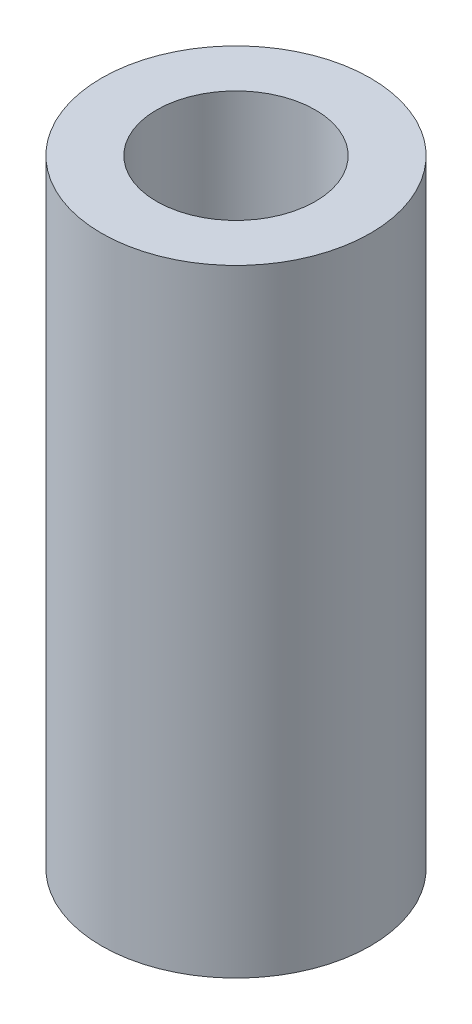
ISO-10303-21;
HEADER;
FILE_DESCRIPTION(('STEP AP214'),'2;1');
FILE_NAME('part.step','',(''),(''),'','','');
FILE_SCHEMA(('AUTOMOTIVE_DESIGN { 1 0 10303 214 1 1 1 1 }'));
ENDSEC;
DATA;
#1=APPLICATION_CONTEXT('core data for automotive mechanical design processes');
#2=APPLICATION_PROTOCOL_DEFINITION('international standard','automotive_design',2000,#1);
#3=PRODUCT_CONTEXT('',#1,'mechanical');
#4=PRODUCT('Part','Part','',(#3));
#5=PRODUCT_RELATED_PRODUCT_CATEGORY('part','',(#4));
#6=PRODUCT_DEFINITION_FORMATION('','',#4);
#7=PRODUCT_DEFINITION_CONTEXT('part definition',#1,'design');
#8=PRODUCT_DEFINITION('design','',#6,#7);
#9=PRODUCT_DEFINITION_SHAPE('','',#8);
#10=(LENGTH_UNIT() NAMED_UNIT(*) SI_UNIT(.MILLI.,.METRE.));
#11=(NAMED_UNIT(*) PLANE_ANGLE_UNIT() SI_UNIT($,.RADIAN.));
#12=(NAMED_UNIT(*) SI_UNIT($,.STERADIAN.) SOLID_ANGLE_UNIT());
#13=UNCERTAINTY_MEASURE_WITH_UNIT(LENGTH_MEASURE(1.E-05),#10,'distance_accuracy_value','');
#14=(GEOMETRIC_REPRESENTATION_CONTEXT(3) GLOBAL_UNCERTAINTY_ASSIGNED_CONTEXT((#13)) GLOBAL_UNIT_ASSIGNED_CONTEXT((#10,
#11,#12)) REPRESENTATION_CONTEXT('',''));
#15=CARTESIAN_POINT('',(0.,0.,0.));
#16=DIRECTION('',(0.,0.,1.));
#17=DIRECTION('',(1.,0.,0.));
#18=AXIS2_PLACEMENT_3D('',#15,#16,#17);
#19=CARTESIAN_POINT('',(0.,7.,0.));
#20=DIRECTION('',(0.,1.,0.));
#21=DIRECTION('',(0.,0.,1.));
#22=AXIS2_PLACEMENT_3D('',#19,#20,#21);
#23=PLANE('',#22);
#24=CARTESIAN_POINT('',(0.,7.,0.));
#25=DIRECTION('',(0.,1.,0.));
#26=DIRECTION('',(0.,0.,1.));
#27=AXIS2_PLACEMENT_3D('',#24,#25,#26);
#28=CIRCLE('',#27,1.525);
#29=CARTESIAN_POINT('',(0.,7.,1.525));
#30=VERTEX_POINT('',#29);
#31=EDGE_CURVE('E10',#30,#30,#28,.T.);
#32=ORIENTED_EDGE('',*,*,#31,.T.);
#33=EDGE_LOOP('',(#32));
#34=FACE_BOUND('',#33,.T.);
#35=CARTESIAN_POINT('',(0.,7.,0.));
#36=DIRECTION('',(0.,1.,0.));
#37=DIRECTION('',(0.,0.,1.));
#38=AXIS2_PLACEMENT_3D('',#35,#36,#37);
#39=CIRCLE('',#38,0.9);
#40=CARTESIAN_POINT('',(0.,7.,0.9));
#41=VERTEX_POINT('',#40);
#42=EDGE_CURVE('E41',#41,#41,#39,.T.);
#43=ORIENTED_EDGE('',*,*,#42,.F.);
#44=EDGE_LOOP('',(#43));
#45=FACE_BOUND('',#44,.T.);
#46=ADVANCED_FACE('F30',(#34,#45),#23,.T.);
#47=CARTESIAN_POINT('',(0.,0.,0.));
#48=DIRECTION('',(0.,1.,0.));
#49=DIRECTION('',(0.,0.,1.));
#50=AXIS2_PLACEMENT_3D('',#47,#48,#49);
#51=PLANE('',#50);
#52=CARTESIAN_POINT('',(0.,0.,0.));
#53=DIRECTION('',(0.,1.,0.));
#54=DIRECTION('',(0.,0.,1.));
#55=AXIS2_PLACEMENT_3D('',#52,#53,#54);
#56=CIRCLE('',#55,1.525);
#57=CARTESIAN_POINT('',(0.,0.,1.525));
#58=VERTEX_POINT('',#57);
#59=EDGE_CURVE('E34',#58,#58,#56,.T.);
#60=ORIENTED_EDGE('',*,*,#59,.F.);
#61=EDGE_LOOP('',(#60));
#62=FACE_BOUND('',#61,.T.);
#63=CARTESIAN_POINT('',(0.,0.,0.));
#64=DIRECTION('',(0.,1.,0.));
#65=DIRECTION('',(0.,0.,1.));
#66=AXIS2_PLACEMENT_3D('',#63,#64,#65);
#67=CIRCLE('',#66,0.9);
#68=CARTESIAN_POINT('',(0.,0.,0.9));
#69=VERTEX_POINT('',#68);
#70=EDGE_CURVE('E43',#69,#69,#67,.T.);
#71=ORIENTED_EDGE('',*,*,#70,.T.);
#72=EDGE_LOOP('',(#71));
#73=FACE_BOUND('',#72,.T.);
#74=ADVANCED_FACE('F53',(#62,#73),#51,.F.);
#75=CARTESIAN_POINT('',(0.,7.,0.));
#76=DIRECTION('',(0.,-1.,0.));
#77=DIRECTION('',(0.,0.,-1.));
#78=AXIS2_PLACEMENT_3D('',#75,#76,#77);
#79=CYLINDRICAL_SURFACE('',#78,1.525);
#80=ORIENTED_EDGE('',*,*,#31,.F.);
#81=EDGE_LOOP('',(#80));
#82=FACE_BOUND('',#81,.T.);
#83=ORIENTED_EDGE('',*,*,#59,.T.);
#84=EDGE_LOOP('',(#83));
#85=FACE_BOUND('',#84,.T.);
#86=ADVANCED_FACE('F32',(#82,#85),#79,.T.);
#87=CARTESIAN_POINT('',(0.,7.,0.));
#88=DIRECTION('',(0.,-1.,0.));
#89=DIRECTION('',(0.,0.,-1.));
#90=AXIS2_PLACEMENT_3D('',#87,#88,#89);
#91=CYLINDRICAL_SURFACE('',#90,0.9);
#92=ORIENTED_EDGE('',*,*,#42,.T.);
#93=EDGE_LOOP('',(#92));
#94=FACE_BOUND('',#93,.T.);
#95=ORIENTED_EDGE('',*,*,#70,.F.);
#96=EDGE_LOOP('',(#95));
#97=FACE_BOUND('',#96,.T.);
#98=ADVANCED_FACE('F49',(#94,#97),#91,.F.);
#99=CLOSED_SHELL('',(#46,#74,#86,#98));
#100=MANIFOLD_SOLID_BREP('B2',#99);
#101=ADVANCED_BREP_SHAPE_REPRESENTATION('',(#18,#100),#14);
#102=SHAPE_DEFINITION_REPRESENTATION(#9,#101);
ENDSEC;
END-ISO-10303-21;
